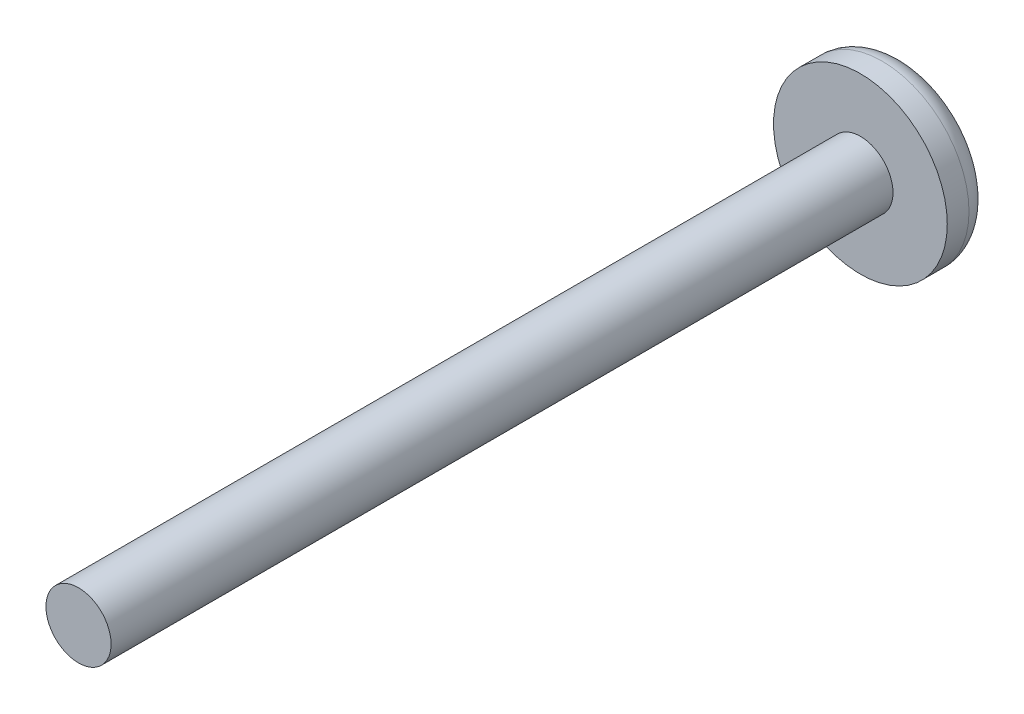
ISO-10303-21;
HEADER;
FILE_DESCRIPTION(('STEP AP214'),'2;1');
FILE_NAME('part.step','',(''),(''),'','','');
FILE_SCHEMA(('AUTOMOTIVE_DESIGN { 1 0 10303 214 1 1 1 1 }'));
ENDSEC;
DATA;
#1=APPLICATION_CONTEXT('core data for automotive mechanical design processes');
#2=APPLICATION_PROTOCOL_DEFINITION('international standard','automotive_design',2000,#1);
#3=PRODUCT_CONTEXT('',#1,'mechanical');
#4=PRODUCT('Part','Part','',(#3));
#5=PRODUCT_RELATED_PRODUCT_CATEGORY('part','',(#4));
#6=PRODUCT_DEFINITION_FORMATION('','',#4);
#7=PRODUCT_DEFINITION_CONTEXT('part definition',#1,'design');
#8=PRODUCT_DEFINITION('design','',#6,#7);
#9=PRODUCT_DEFINITION_SHAPE('','',#8);
#10=(LENGTH_UNIT() NAMED_UNIT(*) SI_UNIT(.MILLI.,.METRE.));
#11=(NAMED_UNIT(*) PLANE_ANGLE_UNIT() SI_UNIT($,.RADIAN.));
#12=(NAMED_UNIT(*) SI_UNIT($,.STERADIAN.) SOLID_ANGLE_UNIT());
#13=UNCERTAINTY_MEASURE_WITH_UNIT(LENGTH_MEASURE(1.E-05),#10,'distance_accuracy_value','');
#14=(GEOMETRIC_REPRESENTATION_CONTEXT(3) GLOBAL_UNCERTAINTY_ASSIGNED_CONTEXT((#13)) GLOBAL_UNIT_ASSIGNED_CONTEXT((#10,
#11,#12)) REPRESENTATION_CONTEXT('',''));
#15=CARTESIAN_POINT('',(0.,0.,0.));
#16=DIRECTION('',(0.,0.,1.));
#17=DIRECTION('',(1.,0.,0.));
#18=AXIS2_PLACEMENT_3D('',#15,#16,#17);
#19=CARTESIAN_POINT('',(0.,0.,-37.));
#20=DIRECTION('',(0.,0.,-1.));
#21=DIRECTION('',(-1.,0.,0.));
#22=AXIS2_PLACEMENT_3D('',#19,#20,#21);
#23=TOROIDAL_SURFACE('',#22,3.,1.);
#24=CARTESIAN_POINT('',(0.,0.,-37.));
#25=DIRECTION('',(0.,0.,-1.));
#26=DIRECTION('',(-1.,0.,0.));
#27=AXIS2_PLACEMENT_3D('',#24,#25,#26);
#28=CIRCLE('',#27,4.);
#29=CARTESIAN_POINT('',(-4.,0.,-37.));
#30=VERTEX_POINT('',#29);
#31=EDGE_CURVE('E39',#30,#30,#28,.F.);
#32=ORIENTED_EDGE('',*,*,#31,.F.);
#33=EDGE_LOOP('',(#32));
#34=FACE_BOUND('',#33,.T.);
#35=CARTESIAN_POINT('',(0.,0.,-38.));
#36=DIRECTION('',(0.,0.,-1.));
#37=DIRECTION('',(-1.,0.,0.));
#38=AXIS2_PLACEMENT_3D('',#35,#36,#37);
#39=CIRCLE('',#38,3.);
#40=CARTESIAN_POINT('',(-3.,0.,-38.));
#41=VERTEX_POINT('',#40);
#42=EDGE_CURVE('E10',#41,#41,#39,.T.);
#43=ORIENTED_EDGE('',*,*,#42,.F.);
#44=EDGE_LOOP('',(#43));
#45=FACE_BOUND('',#44,.T.);
#46=ADVANCED_FACE('F33',(#34,#45),#23,.T.);
#47=CARTESIAN_POINT('',(0.,0.,0.));
#48=DIRECTION('',(0.,0.,1.));
#49=DIRECTION('',(1.,0.,0.));
#50=AXIS2_PLACEMENT_3D('',#47,#48,#49);
#51=PLANE('',#50);
#52=CARTESIAN_POINT('',(0.,0.,0.));
#53=DIRECTION('',(0.,0.,1.));
#54=DIRECTION('',(1.,0.,0.));
#55=AXIS2_PLACEMENT_3D('',#52,#53,#54);
#56=CIRCLE('',#55,1.5);
#57=CARTESIAN_POINT('',(1.5,0.,0.));
#58=VERTEX_POINT('',#57);
#59=EDGE_CURVE('E43',#58,#58,#56,.T.);
#60=ORIENTED_EDGE('',*,*,#59,.T.);
#61=EDGE_LOOP('',(#60));
#62=FACE_BOUND('',#61,.T.);
#63=ADVANCED_FACE('F71',(#62),#51,.T.);
#64=CARTESIAN_POINT('',(0.,0.,0.));
#65=DIRECTION('',(0.,0.,1.));
#66=DIRECTION('',(1.,0.,0.));
#67=AXIS2_PLACEMENT_3D('',#64,#65,#66);
#68=CYLINDRICAL_SURFACE('',#67,1.5);
#69=CARTESIAN_POINT('',(0.,0.,-36.));
#70=DIRECTION('',(0.,0.,1.));
#71=DIRECTION('',(1.,0.,0.));
#72=AXIS2_PLACEMENT_3D('',#69,#70,#71);
#73=CIRCLE('',#72,1.5);
#74=CARTESIAN_POINT('',(1.5,0.,-36.));
#75=VERTEX_POINT('',#74);
#76=EDGE_CURVE('E47',#75,#75,#73,.T.);
#77=ORIENTED_EDGE('',*,*,#76,.T.);
#78=EDGE_LOOP('',(#77));
#79=FACE_BOUND('',#78,.T.);
#80=ORIENTED_EDGE('',*,*,#59,.F.);
#81=EDGE_LOOP('',(#80));
#82=FACE_BOUND('',#81,.T.);
#83=ADVANCED_FACE('F68',(#79,#82),#68,.T.);
#84=CARTESIAN_POINT('',(1.5,0.,-36.));
#85=DIRECTION('',(0.,0.,1.));
#86=DIRECTION('',(1.,0.,0.));
#87=AXIS2_PLACEMENT_3D('',#84,#85,#86);
#88=PLANE('',#87);
#89=CARTESIAN_POINT('',(0.,0.,-36.));
#90=DIRECTION('',(0.,0.,1.));
#91=DIRECTION('',(1.,0.,0.));
#92=AXIS2_PLACEMENT_3D('',#89,#90,#91);
#93=CIRCLE('',#92,4.);
#94=CARTESIAN_POINT('',(4.,0.,-36.));
#95=VERTEX_POINT('',#94);
#96=EDGE_CURVE('E52',#95,#95,#93,.T.);
#97=ORIENTED_EDGE('',*,*,#96,.T.);
#98=EDGE_LOOP('',(#97));
#99=FACE_BOUND('',#98,.T.);
#100=ORIENTED_EDGE('',*,*,#76,.F.);
#101=EDGE_LOOP('',(#100));
#102=FACE_BOUND('',#101,.T.);
#103=ADVANCED_FACE('F56',(#99,#102),#88,.T.);
#104=CARTESIAN_POINT('',(0.,0.,0.));
#105=DIRECTION('',(0.,0.,1.));
#106=DIRECTION('',(1.,0.,0.));
#107=AXIS2_PLACEMENT_3D('',#104,#105,#106);
#108=CYLINDRICAL_SURFACE('',#107,4.);
#109=ORIENTED_EDGE('',*,*,#31,.T.);
#110=EDGE_LOOP('',(#109));
#111=FACE_BOUND('',#110,.T.);
#112=ORIENTED_EDGE('',*,*,#96,.F.);
#113=EDGE_LOOP('',(#112));
#114=FACE_BOUND('',#113,.T.);
#115=ADVANCED_FACE('F59',(#111,#114),#108,.T.);
#116=CARTESIAN_POINT('',(0.,0.,-38.));
#117=DIRECTION('',(0.,0.,-1.));
#118=DIRECTION('',(-1.,0.,0.));
#119=AXIS2_PLACEMENT_3D('',#116,#117,#118);
#120=PLANE('',#119);
#121=ORIENTED_EDGE('',*,*,#42,.T.);
#122=EDGE_LOOP('',(#121));
#123=FACE_BOUND('',#122,.T.);
#124=ADVANCED_FACE('F61',(#123),#120,.T.);
#125=CLOSED_SHELL('',(#46,#63,#83,#103,#115,#124));
#126=MANIFOLD_SOLID_BREP('B2',#125);
#127=ADVANCED_BREP_SHAPE_REPRESENTATION('',(#18,#126),#14);
#128=SHAPE_DEFINITION_REPRESENTATION(#9,#127);
ENDSEC;
END-ISO-10303-21;
